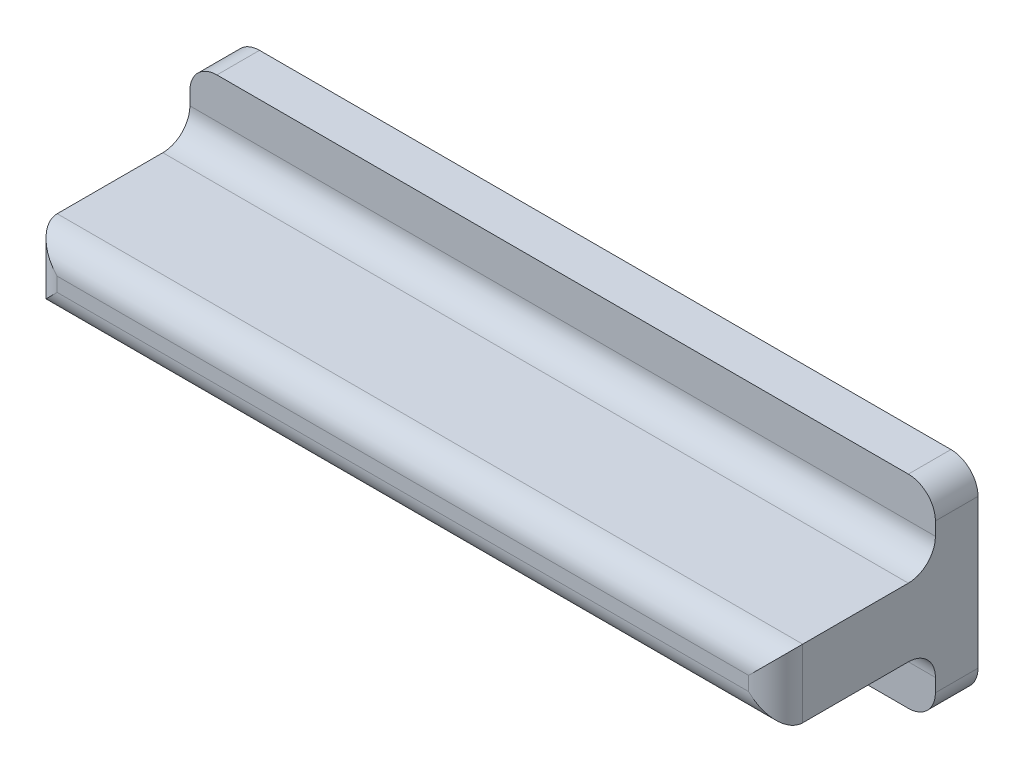
ISO-10303-21;
HEADER;
FILE_DESCRIPTION(('STEP AP214'),'2;1');
FILE_NAME('part.step','',(''),(''),'','','');
FILE_SCHEMA(('AUTOMOTIVE_DESIGN { 1 0 10303 214 1 1 1 1 }'));
ENDSEC;
DATA;
#1=APPLICATION_CONTEXT('core data for automotive mechanical design processes');
#2=APPLICATION_PROTOCOL_DEFINITION('international standard','automotive_design',2000,#1);
#3=PRODUCT_CONTEXT('',#1,'mechanical');
#4=PRODUCT('Part','Part','',(#3));
#5=PRODUCT_RELATED_PRODUCT_CATEGORY('part','',(#4));
#6=PRODUCT_DEFINITION_FORMATION('','',#4);
#7=PRODUCT_DEFINITION_CONTEXT('part definition',#1,'design');
#8=PRODUCT_DEFINITION('design','',#6,#7);
#9=PRODUCT_DEFINITION_SHAPE('','',#8);
#10=(LENGTH_UNIT() NAMED_UNIT(*) SI_UNIT(.MILLI.,.METRE.));
#11=(NAMED_UNIT(*) PLANE_ANGLE_UNIT() SI_UNIT($,.RADIAN.));
#12=(NAMED_UNIT(*) SI_UNIT($,.STERADIAN.) SOLID_ANGLE_UNIT());
#13=UNCERTAINTY_MEASURE_WITH_UNIT(LENGTH_MEASURE(1.E-05),#10,'distance_accuracy_value','');
#14=(GEOMETRIC_REPRESENTATION_CONTEXT(3) GLOBAL_UNCERTAINTY_ASSIGNED_CONTEXT((#13)) GLOBAL_UNIT_ASSIGNED_CONTEXT((#10,
#11,#12)) REPRESENTATION_CONTEXT('',''));
#15=CARTESIAN_POINT('',(0.,0.,0.));
#16=DIRECTION('',(0.,0.,1.));
#17=DIRECTION('',(1.,0.,0.));
#18=AXIS2_PLACEMENT_3D('',#15,#16,#17);
#19=CARTESIAN_POINT('',(0.,0.,4.));
#20=DIRECTION('',(0.,0.,-1.));
#21=DIRECTION('',(-1.,0.,0.));
#22=AXIS2_PLACEMENT_3D('',#19,#20,#21);
#23=PLANE('',#22);
#24=DIRECTION('',(0.,1.,0.));
#25=VECTOR('',#24,1.);
#26=CARTESIAN_POINT('',(35.,-9.525,4.));
#27=LINE('',#26,#25);
#28=CARTESIAN_POINT('',(35.,-6.985,4.));
#29=VERTEX_POINT('',#28);
#30=CARTESIAN_POINT('',(35.,-5.73935897435899,4.));
#31=VERTEX_POINT('',#30);
#32=EDGE_CURVE('E262',#29,#31,#27,.T.);
#33=ORIENTED_EDGE('',*,*,#32,.T.);
#34=DIRECTION('',(1.,0.,0.));
#35=VECTOR('',#34,1.);
#36=CARTESIAN_POINT('',(-35.,-5.73935897435899,4.));
#37=LINE('',#36,#35);
#38=CARTESIAN_POINT('',(-35.,-5.73935897435899,4.));
#39=VERTEX_POINT('',#38);
#40=EDGE_CURVE('E220',#31,#39,#37,.F.);
#41=ORIENTED_EDGE('',*,*,#40,.T.);
#42=DIRECTION('',(0.,-1.,0.));
#43=VECTOR('',#42,1.);
#44=CARTESIAN_POINT('',(-35.,-9.525,4.));
#45=LINE('',#44,#43);
#46=CARTESIAN_POINT('',(-35.,-6.985,4.));
#47=VERTEX_POINT('',#46);
#48=EDGE_CURVE('E269',#39,#47,#45,.T.);
#49=ORIENTED_EDGE('',*,*,#48,.T.);
#50=CARTESIAN_POINT('',(-32.46,-6.985,4.));
#51=DIRECTION('',(0.,0.,-1.));
#52=DIRECTION('',(-1.,0.,0.));
#53=AXIS2_PLACEMENT_3D('',#50,#51,#52);
#54=CIRCLE('',#53,2.54);
#55=CARTESIAN_POINT('',(-32.46,-9.525,4.));
#56=VERTEX_POINT('',#55);
#57=EDGE_CURVE('E218',#47,#56,#54,.F.);
#58=ORIENTED_EDGE('',*,*,#57,.T.);
#59=DIRECTION('',(1.,0.,0.));
#60=VECTOR('',#59,1.);
#61=CARTESIAN_POINT('',(-35.,-9.525,4.));
#62=LINE('',#61,#60);
#63=CARTESIAN_POINT('',(32.46,-9.525,4.));
#64=VERTEX_POINT('',#63);
#65=EDGE_CURVE('E177',#56,#64,#62,.T.);
#66=ORIENTED_EDGE('',*,*,#65,.T.);
#67=CARTESIAN_POINT('',(32.46,-6.985,4.));
#68=DIRECTION('',(0.,0.,-1.));
#69=DIRECTION('',(-1.,0.,0.));
#70=AXIS2_PLACEMENT_3D('',#67,#68,#69);
#71=CIRCLE('',#70,2.54);
#72=EDGE_CURVE('E216',#64,#29,#71,.F.);
#73=ORIENTED_EDGE('',*,*,#72,.T.);
#74=EDGE_LOOP('',(#33,#41,#49,#58,#66,#73));
#75=FACE_BOUND('',#74,.T.);
#76=ADVANCED_FACE('F41',(#75),#23,.F.);
#77=CARTESIAN_POINT('',(-35.,6.98499999999999,4.));
#78=VERTEX_POINT('',#77);
#79=CARTESIAN_POINT('',(-35.,5.73935897435898,4.));
#80=VERTEX_POINT('',#79);
#81=EDGE_CURVE('E270',#78,#80,#45,.T.);
#82=ORIENTED_EDGE('',*,*,#81,.T.);
#83=DIRECTION('',(-1.,0.,0.));
#84=VECTOR('',#83,1.);
#85=CARTESIAN_POINT('',(35.,5.73935897435899,4.));
#86=LINE('',#85,#84);
#87=CARTESIAN_POINT('',(35.,5.73935897435898,4.));
#88=VERTEX_POINT('',#87);
#89=EDGE_CURVE('E214',#80,#88,#86,.F.);
#90=ORIENTED_EDGE('',*,*,#89,.T.);
#91=CARTESIAN_POINT('',(35.,6.98499999999999,4.));
#92=VERTEX_POINT('',#91);
#93=EDGE_CURVE('E266',#88,#92,#27,.T.);
#94=ORIENTED_EDGE('',*,*,#93,.T.);
#95=CARTESIAN_POINT('',(32.46,6.985,4.));
#96=DIRECTION('',(0.,0.,-1.));
#97=DIRECTION('',(-1.,0.,0.));
#98=AXIS2_PLACEMENT_3D('',#95,#96,#97);
#99=CIRCLE('',#98,2.54);
#100=CARTESIAN_POINT('',(32.46,9.525,4.));
#101=VERTEX_POINT('',#100);
#102=EDGE_CURVE('E210',#92,#101,#99,.F.);
#103=ORIENTED_EDGE('',*,*,#102,.T.);
#104=DIRECTION('',(-1.,0.,0.));
#105=VECTOR('',#104,1.);
#106=CARTESIAN_POINT('',(-35.,9.525,4.));
#107=LINE('',#106,#105);
#108=CARTESIAN_POINT('',(-32.46,9.525,4.));
#109=VERTEX_POINT('',#108);
#110=EDGE_CURVE('E265',#101,#109,#107,.T.);
#111=ORIENTED_EDGE('',*,*,#110,.T.);
#112=CARTESIAN_POINT('',(-32.46,6.985,4.));
#113=DIRECTION('',(0.,0.,-1.));
#114=DIRECTION('',(-1.,0.,0.));
#115=AXIS2_PLACEMENT_3D('',#112,#113,#114);
#116=CIRCLE('',#115,2.54);
#117=EDGE_CURVE('E212',#109,#78,#116,.F.);
#118=ORIENTED_EDGE('',*,*,#117,.T.);
#119=EDGE_LOOP('',(#82,#90,#94,#103,#111,#118));
#120=FACE_BOUND('',#119,.T.);
#121=ADVANCED_FACE('F323',(#120),#23,.F.);
#122=CARTESIAN_POINT('',(35.,-9.525,4.));
#123=DIRECTION('',(-1.,0.,0.));
#124=DIRECTION('',(0.,0.,1.));
#125=AXIS2_PLACEMENT_3D('',#122,#123,#124);
#126=PLANE('',#125);
#127=DIRECTION('',(0.,0.,-1.));
#128=VECTOR('',#127,1.);
#129=CARTESIAN_POINT('',(35.,3.19935897435899,19.));
#130=LINE('',#129,#128);
#131=CARTESIAN_POINT('',(35.,3.19935897435899,16.46));
#132=VERTEX_POINT('',#131);
#133=CARTESIAN_POINT('',(35.,3.19935897435899,6.54));
#134=VERTEX_POINT('',#133);
#135=EDGE_CURVE('E258',#132,#134,#130,.T.);
#136=ORIENTED_EDGE('',*,*,#135,.F.);
#137=DIRECTION('',(0.,1.,0.));
#138=VECTOR('',#137,1.);
#139=CARTESIAN_POINT('',(35.,-9.525,16.46));
#140=LINE('',#139,#138);
#141=CARTESIAN_POINT('',(35.,-3.19935897435899,16.46));
#142=VERTEX_POINT('',#141);
#143=EDGE_CURVE('E208',#132,#142,#140,.F.);
#144=ORIENTED_EDGE('',*,*,#143,.T.);
#145=DIRECTION('',(0.,0.,-1.));
#146=VECTOR('',#145,1.);
#147=CARTESIAN_POINT('',(35.,-3.19935897435899,19.));
#148=LINE('',#147,#146);
#149=CARTESIAN_POINT('',(35.,-3.19935897435899,6.54));
#150=VERTEX_POINT('',#149);
#151=EDGE_CURVE('E243',#142,#150,#148,.T.);
#152=ORIENTED_EDGE('',*,*,#151,.T.);
#153=CARTESIAN_POINT('',(35.,-5.73935897435899,6.54));
#154=DIRECTION('',(-1.,0.,0.));
#155=DIRECTION('',(0.,0.,1.));
#156=AXIS2_PLACEMENT_3D('',#153,#154,#155);
#157=CIRCLE('',#156,2.54);
#158=EDGE_CURVE('E50',#150,#31,#157,.T.);
#159=ORIENTED_EDGE('',*,*,#158,.T.);
#160=ORIENTED_EDGE('',*,*,#32,.F.);
#161=DIRECTION('',(0.,0.,-1.));
#162=VECTOR('',#161,1.);
#163=CARTESIAN_POINT('',(35.,-6.985,4.));
#164=LINE('',#163,#162);
#165=CARTESIAN_POINT('',(35.,-6.985,0.));
#166=VERTEX_POINT('',#165);
#167=EDGE_CURVE('E203',#29,#166,#164,.T.);
#168=ORIENTED_EDGE('',*,*,#167,.T.);
#169=DIRECTION('',(0.,1.,0.));
#170=VECTOR('',#169,1.);
#171=CARTESIAN_POINT('',(35.,-9.525,0.));
#172=LINE('',#171,#170);
#173=CARTESIAN_POINT('',(35.,6.98499999999999,0.));
#174=VERTEX_POINT('',#173);
#175=EDGE_CURVE('E261',#166,#174,#172,.T.);
#176=ORIENTED_EDGE('',*,*,#175,.T.);
#177=DIRECTION('',(0.,0.,-1.));
#178=VECTOR('',#177,1.);
#179=CARTESIAN_POINT('',(35.,6.985,4.));
#180=LINE('',#179,#178);
#181=EDGE_CURVE('E206',#174,#92,#180,.F.);
#182=ORIENTED_EDGE('',*,*,#181,.T.);
#183=ORIENTED_EDGE('',*,*,#93,.F.);
#184=CARTESIAN_POINT('',(35.,5.73935897435899,6.54));
#185=DIRECTION('',(-1.,0.,0.));
#186=DIRECTION('',(0.,0.,1.));
#187=AXIS2_PLACEMENT_3D('',#184,#185,#186);
#188=CIRCLE('',#187,2.54);
#189=EDGE_CURVE('E239',#88,#134,#188,.T.);
#190=ORIENTED_EDGE('',*,*,#189,.T.);
#191=EDGE_LOOP('',(#136,#144,#152,#159,#160,#168,#176,#182,#183,#190));
#192=FACE_BOUND('',#191,.T.);
#193=ADVANCED_FACE('F303',(#192),#126,.F.);
#194=CARTESIAN_POINT('',(-35.,9.525,4.));
#195=DIRECTION('',(0.,-1.,0.));
#196=DIRECTION('',(0.,0.,-1.));
#197=AXIS2_PLACEMENT_3D('',#194,#195,#196);
#198=PLANE('',#197);
#199=DIRECTION('',(-1.,0.,0.));
#200=VECTOR('',#199,1.);
#201=CARTESIAN_POINT('',(-35.,9.525,0.));
#202=LINE('',#201,#200);
#203=CARTESIAN_POINT('',(32.46,9.525,0.));
#204=VERTEX_POINT('',#203);
#205=CARTESIAN_POINT('',(-32.46,9.525,0.));
#206=VERTEX_POINT('',#205);
#207=EDGE_CURVE('E277',#204,#206,#202,.T.);
#208=ORIENTED_EDGE('',*,*,#207,.T.);
#209=DIRECTION('',(0.,0.,-1.));
#210=VECTOR('',#209,1.);
#211=CARTESIAN_POINT('',(-32.46,9.525,4.));
#212=LINE('',#211,#210);
#213=EDGE_CURVE('E235',#206,#109,#212,.F.);
#214=ORIENTED_EDGE('',*,*,#213,.T.);
#215=ORIENTED_EDGE('',*,*,#110,.F.);
#216=DIRECTION('',(0.,0.,-1.));
#217=VECTOR('',#216,1.);
#218=CARTESIAN_POINT('',(32.46,9.525,4.));
#219=LINE('',#218,#217);
#220=EDGE_CURVE('E233',#101,#204,#219,.T.);
#221=ORIENTED_EDGE('',*,*,#220,.T.);
#222=EDGE_LOOP('',(#208,#214,#215,#221));
#223=FACE_BOUND('',#222,.T.);
#224=ADVANCED_FACE('F315',(#223),#198,.F.);
#225=CARTESIAN_POINT('',(-35.,-9.525,4.));
#226=DIRECTION('',(1.,0.,0.));
#227=DIRECTION('',(0.,0.,-1.));
#228=AXIS2_PLACEMENT_3D('',#225,#226,#227);
#229=PLANE('',#228);
#230=DIRECTION('',(0.,0.,-1.));
#231=VECTOR('',#230,1.);
#232=CARTESIAN_POINT('',(-35.,-3.19935897435899,19.));
#233=LINE('',#232,#231);
#234=CARTESIAN_POINT('',(-35.,-3.19935897435899,16.46));
#235=VERTEX_POINT('',#234);
#236=CARTESIAN_POINT('',(-35.,-3.19935897435899,6.54));
#237=VERTEX_POINT('',#236);
#238=EDGE_CURVE('E248',#235,#237,#233,.T.);
#239=ORIENTED_EDGE('',*,*,#238,.F.);
#240=DIRECTION('',(0.,-1.,0.));
#241=VECTOR('',#240,1.);
#242=CARTESIAN_POINT('',(-35.,-9.525,16.46));
#243=LINE('',#242,#241);
#244=CARTESIAN_POINT('',(-35.,3.19935897435899,16.46));
#245=VERTEX_POINT('',#244);
#246=EDGE_CURVE('E196',#235,#245,#243,.F.);
#247=ORIENTED_EDGE('',*,*,#246,.T.);
#248=DIRECTION('',(0.,0.,-1.));
#249=VECTOR('',#248,1.);
#250=CARTESIAN_POINT('',(-35.,3.19935897435899,19.));
#251=LINE('',#250,#249);
#252=CARTESIAN_POINT('',(-35.,3.19935897435899,6.54));
#253=VERTEX_POINT('',#252);
#254=EDGE_CURVE('E253',#245,#253,#251,.T.);
#255=ORIENTED_EDGE('',*,*,#254,.T.);
#256=CARTESIAN_POINT('',(-35.,5.73935897435899,6.54));
#257=DIRECTION('',(1.,0.,0.));
#258=DIRECTION('',(0.,0.,-1.));
#259=AXIS2_PLACEMENT_3D('',#256,#257,#258);
#260=CIRCLE('',#259,2.54);
#261=EDGE_CURVE('E237',#253,#80,#260,.T.);
#262=ORIENTED_EDGE('',*,*,#261,.T.);
#263=ORIENTED_EDGE('',*,*,#81,.F.);
#264=DIRECTION('',(0.,0.,-1.));
#265=VECTOR('',#264,1.);
#266=CARTESIAN_POINT('',(-35.,6.985,4.));
#267=LINE('',#266,#265);
#268=CARTESIAN_POINT('',(-35.,6.98499999999999,0.));
#269=VERTEX_POINT('',#268);
#270=EDGE_CURVE('E191',#78,#269,#267,.T.);
#271=ORIENTED_EDGE('',*,*,#270,.T.);
#272=DIRECTION('',(0.,-1.,0.));
#273=VECTOR('',#272,1.);
#274=CARTESIAN_POINT('',(-35.,-9.525,0.));
#275=LINE('',#274,#273);
#276=CARTESIAN_POINT('',(-35.,-6.985,0.));
#277=VERTEX_POINT('',#276);
#278=EDGE_CURVE('E279',#269,#277,#275,.T.);
#279=ORIENTED_EDGE('',*,*,#278,.T.);
#280=DIRECTION('',(0.,0.,-1.));
#281=VECTOR('',#280,1.);
#282=CARTESIAN_POINT('',(-35.,-6.985,4.));
#283=LINE('',#282,#281);
#284=EDGE_CURVE('E194',#277,#47,#283,.F.);
#285=ORIENTED_EDGE('',*,*,#284,.T.);
#286=ORIENTED_EDGE('',*,*,#48,.F.);
#287=CARTESIAN_POINT('',(-35.,-5.73935897435899,6.54));
#288=DIRECTION('',(1.,0.,0.));
#289=DIRECTION('',(0.,0.,-1.));
#290=AXIS2_PLACEMENT_3D('',#287,#288,#289);
#291=CIRCLE('',#290,2.54);
#292=EDGE_CURVE('E11',#39,#237,#291,.T.);
#293=ORIENTED_EDGE('',*,*,#292,.T.);
#294=EDGE_LOOP('',(#239,#247,#255,#262,#263,#271,#279,#285,#286,#293));
#295=FACE_BOUND('',#294,.T.);
#296=ADVANCED_FACE('F294',(#295),#229,.F.);
#297=CARTESIAN_POINT('',(-35.,-9.525,4.));
#298=DIRECTION('',(0.,1.,0.));
#299=DIRECTION('',(0.,0.,1.));
#300=AXIS2_PLACEMENT_3D('',#297,#298,#299);
#301=PLANE('',#300);
#302=ORIENTED_EDGE('',*,*,#65,.F.);
#303=DIRECTION('',(0.,0.,-1.));
#304=VECTOR('',#303,1.);
#305=CARTESIAN_POINT('',(-32.46,-9.525,4.));
#306=LINE('',#305,#304);
#307=CARTESIAN_POINT('',(-32.46,-9.525,0.));
#308=VERTEX_POINT('',#307);
#309=EDGE_CURVE('E224',#56,#308,#306,.T.);
#310=ORIENTED_EDGE('',*,*,#309,.T.);
#311=DIRECTION('',(1.,0.,0.));
#312=VECTOR('',#311,1.);
#313=CARTESIAN_POINT('',(-35.,-9.525,0.));
#314=LINE('',#313,#312);
#315=CARTESIAN_POINT('',(32.46,-9.525,0.));
#316=VERTEX_POINT('',#315);
#317=EDGE_CURVE('E282',#308,#316,#314,.T.);
#318=ORIENTED_EDGE('',*,*,#317,.T.);
#319=DIRECTION('',(0.,0.,-1.));
#320=VECTOR('',#319,1.);
#321=CARTESIAN_POINT('',(32.46,-9.525,4.));
#322=LINE('',#321,#320);
#323=EDGE_CURVE('E222',#316,#64,#322,.F.);
#324=ORIENTED_EDGE('',*,*,#323,.T.);
#325=EDGE_LOOP('',(#302,#310,#318,#324));
#326=FACE_BOUND('',#325,.T.);
#327=ADVANCED_FACE('F352',(#326),#301,.F.);
#328=CARTESIAN_POINT('',(0.,0.,0.));
#329=DIRECTION('',(0.,0.,-1.));
#330=DIRECTION('',(-1.,0.,0.));
#331=AXIS2_PLACEMENT_3D('',#328,#329,#330);
#332=PLANE('',#331);
#333=ORIENTED_EDGE('',*,*,#317,.F.);
#334=CARTESIAN_POINT('',(-32.46,-6.985,0.));
#335=DIRECTION('',(0.,0.,-1.));
#336=DIRECTION('',(-1.,0.,0.));
#337=AXIS2_PLACEMENT_3D('',#334,#335,#336);
#338=CIRCLE('',#337,2.54);
#339=EDGE_CURVE('E231',#308,#277,#338,.T.);
#340=ORIENTED_EDGE('',*,*,#339,.T.);
#341=ORIENTED_EDGE('',*,*,#278,.F.);
#342=CARTESIAN_POINT('',(-32.46,6.985,0.));
#343=DIRECTION('',(0.,0.,-1.));
#344=DIRECTION('',(-1.,0.,0.));
#345=AXIS2_PLACEMENT_3D('',#342,#343,#344);
#346=CIRCLE('',#345,2.54);
#347=EDGE_CURVE('E58',#269,#206,#346,.T.);
#348=ORIENTED_EDGE('',*,*,#347,.T.);
#349=ORIENTED_EDGE('',*,*,#207,.F.);
#350=CARTESIAN_POINT('',(32.46,6.985,0.));
#351=DIRECTION('',(0.,0.,-1.));
#352=DIRECTION('',(-1.,0.,0.));
#353=AXIS2_PLACEMENT_3D('',#350,#351,#352);
#354=CIRCLE('',#353,2.54);
#355=EDGE_CURVE('E66',#204,#174,#354,.T.);
#356=ORIENTED_EDGE('',*,*,#355,.T.);
#357=ORIENTED_EDGE('',*,*,#175,.F.);
#358=CARTESIAN_POINT('',(32.46,-6.985,0.));
#359=DIRECTION('',(0.,0.,-1.));
#360=DIRECTION('',(-1.,0.,0.));
#361=AXIS2_PLACEMENT_3D('',#358,#359,#360);
#362=CIRCLE('',#361,2.54);
#363=EDGE_CURVE('E227',#166,#316,#362,.T.);
#364=ORIENTED_EDGE('',*,*,#363,.T.);
#365=EDGE_LOOP('',(#333,#340,#341,#348,#349,#356,#357,#364));
#366=FACE_BOUND('',#365,.T.);
#367=ADVANCED_FACE('F312',(#366),#332,.T.);
#368=CARTESIAN_POINT('',(-35.,3.19935897435899,19.));
#369=DIRECTION('',(0.,-1.,0.));
#370=DIRECTION('',(0.,0.,-1.));
#371=AXIS2_PLACEMENT_3D('',#368,#369,#370);
#372=PLANE('',#371);
#373=ORIENTED_EDGE('',*,*,#254,.F.);
#374=DIRECTION('',(-1.,0.,0.));
#375=VECTOR('',#374,1.);
#376=CARTESIAN_POINT('',(-35.,3.19935897435899,16.46));
#377=LINE('',#376,#375);
#378=EDGE_CURVE('E201',#245,#132,#377,.F.);
#379=ORIENTED_EDGE('',*,*,#378,.T.);
#380=ORIENTED_EDGE('',*,*,#135,.T.);
#381=DIRECTION('',(-1.,0.,0.));
#382=VECTOR('',#381,1.);
#383=CARTESIAN_POINT('',(-35.,3.19935897435899,6.54));
#384=LINE('',#383,#382);
#385=EDGE_CURVE('E198',#134,#253,#384,.T.);
#386=ORIENTED_EDGE('',*,*,#385,.T.);
#387=EDGE_LOOP('',(#373,#379,#380,#386));
#388=FACE_BOUND('',#387,.T.);
#389=ADVANCED_FACE('F330',(#388),#372,.F.);
#390=CARTESIAN_POINT('',(-35.,-3.19935897435899,19.));
#391=DIRECTION('',(0.,1.,0.));
#392=DIRECTION('',(0.,0.,1.));
#393=AXIS2_PLACEMENT_3D('',#390,#391,#392);
#394=PLANE('',#393);
#395=ORIENTED_EDGE('',*,*,#151,.F.);
#396=DIRECTION('',(1.,0.,0.));
#397=VECTOR('',#396,1.);
#398=CARTESIAN_POINT('',(-35.,-3.19935897435899,16.46));
#399=LINE('',#398,#397);
#400=EDGE_CURVE('E164',#142,#235,#399,.F.);
#401=ORIENTED_EDGE('',*,*,#400,.T.);
#402=ORIENTED_EDGE('',*,*,#238,.T.);
#403=DIRECTION('',(1.,0.,0.));
#404=VECTOR('',#403,1.);
#405=CARTESIAN_POINT('',(35.,-3.19935897435899,6.54));
#406=LINE('',#405,#404);
#407=EDGE_CURVE('E183',#237,#150,#406,.T.);
#408=ORIENTED_EDGE('',*,*,#407,.T.);
#409=EDGE_LOOP('',(#395,#401,#402,#408));
#410=FACE_BOUND('',#409,.T.);
#411=ADVANCED_FACE('F292',(#410),#394,.F.);
#412=CARTESIAN_POINT('',(0.,0.,19.));
#413=DIRECTION('',(0.,0.,-1.));
#414=DIRECTION('',(-1.,0.,0.));
#415=AXIS2_PLACEMENT_3D('',#412,#413,#414);
#416=PLANE('',#415);
#417=DIRECTION('',(0.,-1.,0.));
#418=VECTOR('',#417,1.);
#419=CARTESIAN_POINT('',(-32.46,0.,19.));
#420=LINE('',#419,#418);
#421=CARTESIAN_POINT('',(-32.46,0.659358974358985,19.));
#422=VERTEX_POINT('',#421);
#423=CARTESIAN_POINT('',(-32.46,-0.659358974358985,19.));
#424=VERTEX_POINT('',#423);
#425=EDGE_CURVE('E181',#422,#424,#420,.T.);
#426=ORIENTED_EDGE('',*,*,#425,.T.);
#427=DIRECTION('',(1.,0.,0.));
#428=VECTOR('',#427,1.);
#429=CARTESIAN_POINT('',(0.,-0.659358974358985,19.));
#430=LINE('',#429,#428);
#431=CARTESIAN_POINT('',(32.46,-0.659358974358985,19.));
#432=VERTEX_POINT('',#431);
#433=EDGE_CURVE('E162',#424,#432,#430,.T.);
#434=ORIENTED_EDGE('',*,*,#433,.T.);
#435=DIRECTION('',(0.,1.,0.));
#436=VECTOR('',#435,1.);
#437=CARTESIAN_POINT('',(32.46,0.,19.));
#438=LINE('',#437,#436);
#439=CARTESIAN_POINT('',(32.46,0.659358974358985,19.));
#440=VERTEX_POINT('',#439);
#441=EDGE_CURVE('E170',#432,#440,#438,.T.);
#442=ORIENTED_EDGE('',*,*,#441,.T.);
#443=DIRECTION('',(-1.,0.,0.));
#444=VECTOR('',#443,1.);
#445=CARTESIAN_POINT('',(0.,0.659358974358985,19.));
#446=LINE('',#445,#444);
#447=EDGE_CURVE('E176',#440,#422,#446,.T.);
#448=ORIENTED_EDGE('',*,*,#447,.T.);
#449=EDGE_LOOP('',(#426,#434,#442,#448));
#450=FACE_BOUND('',#449,.T.);
#451=ADVANCED_FACE('F179',(#450),#416,.F.);
#452=CARTESIAN_POINT('',(0.,0.659358974358985,16.46));
#453=DIRECTION('',(-1.,0.,0.));
#454=DIRECTION('',(0.,0.,1.));
#455=AXIS2_PLACEMENT_3D('',#452,#453,#454);
#456=CYLINDRICAL_SURFACE('',#455,2.54);
#457=CARTESIAN_POINT('',(32.46,0.659358974358985,16.46));
#458=DIRECTION('',(-0.707106781186547,0.707106781186547,0.));
#459=DIRECTION('',(0.707106781186547,0.707106781186547,0.));
#460=AXIS2_PLACEMENT_3D('',#457,#458,#459);
#461=ELLIPSE('',#460,3.59210244842766,2.54);
#462=EDGE_CURVE('E173',#132,#440,#461,.F.);
#463=ORIENTED_EDGE('',*,*,#462,.F.);
#464=ORIENTED_EDGE('',*,*,#378,.F.);
#465=CARTESIAN_POINT('',(-32.46,0.659358974358985,16.46));
#466=DIRECTION('',(-0.707106781186547,-0.707106781186547,0.));
#467=DIRECTION('',(-0.707106781186547,0.707106781186547,0.));
#468=AXIS2_PLACEMENT_3D('',#465,#466,#467);
#469=ELLIPSE('',#468,3.59210244842766,2.54);
#470=EDGE_CURVE('E45',#422,#245,#469,.T.);
#471=ORIENTED_EDGE('',*,*,#470,.F.);
#472=ORIENTED_EDGE('',*,*,#447,.F.);
#473=EDGE_LOOP('',(#463,#464,#471,#472));
#474=FACE_BOUND('',#473,.T.);
#475=ADVANCED_FACE('F286',(#474),#456,.T.);
#476=CARTESIAN_POINT('',(-32.46,0.,16.46));
#477=DIRECTION('',(0.,-1.,0.));
#478=DIRECTION('',(0.,0.,-1.));
#479=AXIS2_PLACEMENT_3D('',#476,#477,#478);
#480=CYLINDRICAL_SURFACE('',#479,2.54);
#481=ORIENTED_EDGE('',*,*,#470,.T.);
#482=ORIENTED_EDGE('',*,*,#246,.F.);
#483=CARTESIAN_POINT('',(-32.46,-0.659358974358985,16.46));
#484=DIRECTION('',(0.707106781186547,-0.707106781186547,0.));
#485=DIRECTION('',(-0.707106781186547,-0.707106781186547,0.));
#486=AXIS2_PLACEMENT_3D('',#483,#484,#485);
#487=ELLIPSE('',#486,3.59210244842766,2.54);
#488=EDGE_CURVE('E167',#424,#235,#487,.T.);
#489=ORIENTED_EDGE('',*,*,#488,.F.);
#490=ORIENTED_EDGE('',*,*,#425,.F.);
#491=EDGE_LOOP('',(#481,#482,#489,#490));
#492=FACE_BOUND('',#491,.T.);
#493=ADVANCED_FACE('F287',(#492),#480,.T.);
#494=CARTESIAN_POINT('',(32.46,0.,16.46));
#495=DIRECTION('',(0.,1.,0.));
#496=DIRECTION('',(0.,0.,1.));
#497=AXIS2_PLACEMENT_3D('',#494,#495,#496);
#498=CYLINDRICAL_SURFACE('',#497,2.54);
#499=ORIENTED_EDGE('',*,*,#462,.T.);
#500=ORIENTED_EDGE('',*,*,#441,.F.);
#501=CARTESIAN_POINT('',(32.46,-0.659358974358985,16.46));
#502=DIRECTION('',(0.707106781186547,0.707106781186547,0.));
#503=DIRECTION('',(-0.707106781186547,0.707106781186547,0.));
#504=AXIS2_PLACEMENT_3D('',#501,#502,#503);
#505=ELLIPSE('',#504,3.59210244842766,2.54);
#506=EDGE_CURVE('E158',#142,#432,#505,.F.);
#507=ORIENTED_EDGE('',*,*,#506,.F.);
#508=ORIENTED_EDGE('',*,*,#143,.F.);
#509=EDGE_LOOP('',(#499,#500,#507,#508));
#510=FACE_BOUND('',#509,.T.);
#511=ADVANCED_FACE('F171',(#510),#498,.T.);
#512=CARTESIAN_POINT('',(0.,-0.659358974358985,16.46));
#513=DIRECTION('',(1.,0.,0.));
#514=DIRECTION('',(0.,0.,-1.));
#515=AXIS2_PLACEMENT_3D('',#512,#513,#514);
#516=CYLINDRICAL_SURFACE('',#515,2.54);
#517=ORIENTED_EDGE('',*,*,#488,.T.);
#518=ORIENTED_EDGE('',*,*,#400,.F.);
#519=ORIENTED_EDGE('',*,*,#506,.T.);
#520=ORIENTED_EDGE('',*,*,#433,.F.);
#521=EDGE_LOOP('',(#517,#518,#519,#520));
#522=FACE_BOUND('',#521,.T.);
#523=ADVANCED_FACE('F160',(#522),#516,.T.);
#524=CARTESIAN_POINT('',(-35.,5.73935897435899,6.54));
#525=DIRECTION('',(1.,0.,0.));
#526=DIRECTION('',(0.,0.,-1.));
#527=AXIS2_PLACEMENT_3D('',#524,#525,#526);
#528=CYLINDRICAL_SURFACE('',#527,2.54);
#529=ORIENTED_EDGE('',*,*,#189,.F.);
#530=ORIENTED_EDGE('',*,*,#89,.F.);
#531=ORIENTED_EDGE('',*,*,#261,.F.);
#532=ORIENTED_EDGE('',*,*,#385,.F.);
#533=EDGE_LOOP('',(#529,#530,#531,#532));
#534=FACE_BOUND('',#533,.T.);
#535=ADVANCED_FACE('F328',(#534),#528,.F.);
#536=CARTESIAN_POINT('',(-35.,-5.73935897435899,6.54));
#537=DIRECTION('',(-1.,0.,0.));
#538=DIRECTION('',(0.,0.,1.));
#539=AXIS2_PLACEMENT_3D('',#536,#537,#538);
#540=CYLINDRICAL_SURFACE('',#539,2.54);
#541=ORIENTED_EDGE('',*,*,#292,.F.);
#542=ORIENTED_EDGE('',*,*,#40,.F.);
#543=ORIENTED_EDGE('',*,*,#158,.F.);
#544=ORIENTED_EDGE('',*,*,#407,.F.);
#545=EDGE_LOOP('',(#541,#542,#543,#544));
#546=FACE_BOUND('',#545,.T.);
#547=ADVANCED_FACE('F300',(#546),#540,.F.);
#548=CARTESIAN_POINT('',(-32.46,-6.985,4.));
#549=DIRECTION('',(0.,0.,-1.));
#550=DIRECTION('',(-1.,0.,0.));
#551=AXIS2_PLACEMENT_3D('',#548,#549,#550);
#552=CYLINDRICAL_SURFACE('',#551,2.54);
#553=ORIENTED_EDGE('',*,*,#57,.F.);
#554=ORIENTED_EDGE('',*,*,#284,.F.);
#555=ORIENTED_EDGE('',*,*,#339,.F.);
#556=ORIENTED_EDGE('',*,*,#309,.F.);
#557=EDGE_LOOP('',(#553,#554,#555,#556));
#558=FACE_BOUND('',#557,.T.);
#559=ADVANCED_FACE('F340',(#558),#552,.T.);
#560=CARTESIAN_POINT('',(-32.46,6.985,4.));
#561=DIRECTION('',(0.,0.,-1.));
#562=DIRECTION('',(-1.,0.,0.));
#563=AXIS2_PLACEMENT_3D('',#560,#561,#562);
#564=CYLINDRICAL_SURFACE('',#563,2.54);
#565=ORIENTED_EDGE('',*,*,#117,.F.);
#566=ORIENTED_EDGE('',*,*,#213,.F.);
#567=ORIENTED_EDGE('',*,*,#347,.F.);
#568=ORIENTED_EDGE('',*,*,#270,.F.);
#569=EDGE_LOOP('',(#565,#566,#567,#568));
#570=FACE_BOUND('',#569,.T.);
#571=ADVANCED_FACE('F319',(#570),#564,.T.);
#572=CARTESIAN_POINT('',(32.46,6.985,4.));
#573=DIRECTION('',(0.,0.,-1.));
#574=DIRECTION('',(-1.,0.,0.));
#575=AXIS2_PLACEMENT_3D('',#572,#573,#574);
#576=CYLINDRICAL_SURFACE('',#575,2.54);
#577=ORIENTED_EDGE('',*,*,#102,.F.);
#578=ORIENTED_EDGE('',*,*,#181,.F.);
#579=ORIENTED_EDGE('',*,*,#355,.F.);
#580=ORIENTED_EDGE('',*,*,#220,.F.);
#581=EDGE_LOOP('',(#577,#578,#579,#580));
#582=FACE_BOUND('',#581,.T.);
#583=ADVANCED_FACE('F334',(#582),#576,.T.);
#584=CARTESIAN_POINT('',(32.46,-6.985,4.));
#585=DIRECTION('',(0.,0.,-1.));
#586=DIRECTION('',(-1.,0.,0.));
#587=AXIS2_PLACEMENT_3D('',#584,#585,#586);
#588=CYLINDRICAL_SURFACE('',#587,2.54);
#589=ORIENTED_EDGE('',*,*,#72,.F.);
#590=ORIENTED_EDGE('',*,*,#323,.F.);
#591=ORIENTED_EDGE('',*,*,#363,.F.);
#592=ORIENTED_EDGE('',*,*,#167,.F.);
#593=EDGE_LOOP('',(#589,#590,#591,#592));
#594=FACE_BOUND('',#593,.T.);
#595=ADVANCED_FACE('F43',(#594),#588,.T.);
#596=CLOSED_SHELL('',(#76,#121,#193,#224,#296,#327,#367,#389,#411,#451,#475,#493,#511,#523,#535,
#547,#559,#571,#583,#595));
#597=MANIFOLD_SOLID_BREP('B2',#596);
#598=ADVANCED_BREP_SHAPE_REPRESENTATION('',(#18,#597),#14);
#599=SHAPE_DEFINITION_REPRESENTATION(#9,#598);
ENDSEC;
END-ISO-10303-21;
